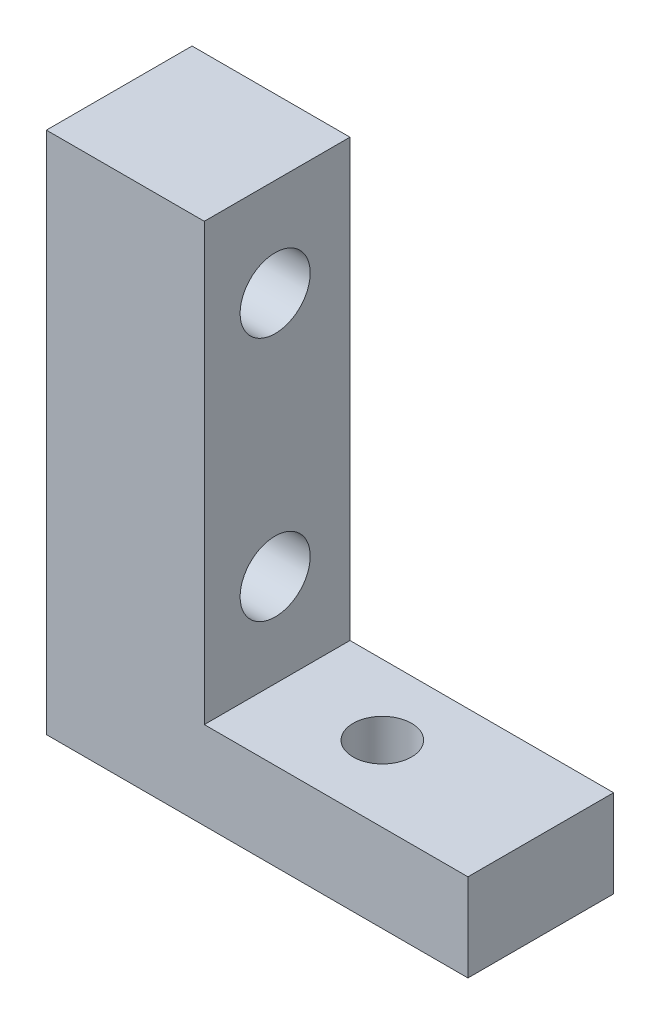
ISO-10303-21;
HEADER;
FILE_DESCRIPTION(('STEP AP214'),'2;1');
FILE_NAME('part.step','',(''),(''),'','','');
FILE_SCHEMA(('AUTOMOTIVE_DESIGN { 1 0 10303 214 1 1 1 1 }'));
ENDSEC;
DATA;
#1=APPLICATION_CONTEXT('core data for automotive mechanical design processes');
#2=APPLICATION_PROTOCOL_DEFINITION('international standard','automotive_design',2000,#1);
#3=PRODUCT_CONTEXT('',#1,'mechanical');
#4=PRODUCT('Part','Part','',(#3));
#5=PRODUCT_RELATED_PRODUCT_CATEGORY('part','',(#4));
#6=PRODUCT_DEFINITION_FORMATION('','',#4);
#7=PRODUCT_DEFINITION_CONTEXT('part definition',#1,'design');
#8=PRODUCT_DEFINITION('design','',#6,#7);
#9=PRODUCT_DEFINITION_SHAPE('','',#8);
#10=(LENGTH_UNIT() NAMED_UNIT(*) SI_UNIT(.MILLI.,.METRE.));
#11=(NAMED_UNIT(*) PLANE_ANGLE_UNIT() SI_UNIT($,.RADIAN.));
#12=(NAMED_UNIT(*) SI_UNIT($,.STERADIAN.) SOLID_ANGLE_UNIT());
#13=UNCERTAINTY_MEASURE_WITH_UNIT(LENGTH_MEASURE(1.E-05),#10,'distance_accuracy_value','');
#14=(GEOMETRIC_REPRESENTATION_CONTEXT(3) GLOBAL_UNCERTAINTY_ASSIGNED_CONTEXT((#13)) GLOBAL_UNIT_ASSIGNED_CONTEXT((#10,
#11,#12)) REPRESENTATION_CONTEXT('',''));
#15=CARTESIAN_POINT('',(0.,0.,0.));
#16=DIRECTION('',(0.,0.,1.));
#17=DIRECTION('',(1.,0.,0.));
#18=AXIS2_PLACEMENT_3D('',#15,#16,#17);
#19=CARTESIAN_POINT('',(0.,3.81,-6.33268934560505));
#20=DIRECTION('',(0.,-1.,0.));
#21=DIRECTION('',(0.,0.,-1.));
#22=AXIS2_PLACEMENT_3D('',#19,#20,#21);
#23=PLANE('',#22);
#24=DIRECTION('',(-1.,0.,0.));
#25=VECTOR('',#24,1.);
#26=CARTESIAN_POINT('',(0.,3.81,-6.33268934560505));
#27=LINE('',#26,#25);
#28=CARTESIAN_POINT('',(18.3256643514369,3.81,-6.33268934560505));
#29=VERTEX_POINT('',#28);
#30=CARTESIAN_POINT('',(6.86474232692635,3.81,-6.33268934560505));
#31=VERTEX_POINT('',#30);
#32=EDGE_CURVE('E101',#29,#31,#27,.T.);
#33=ORIENTED_EDGE('',*,*,#32,.T.);
#34=DIRECTION('',(0.,0.,1.));
#35=VECTOR('',#34,1.);
#36=CARTESIAN_POINT('',(6.86474232692635,3.81,0.));
#37=LINE('',#36,#35);
#38=CARTESIAN_POINT('',(6.86474232692635,3.81,0.));
#39=VERTEX_POINT('',#38);
#40=EDGE_CURVE('E126',#31,#39,#37,.T.);
#41=ORIENTED_EDGE('',*,*,#40,.T.);
#42=DIRECTION('',(1.,0.,0.));
#43=VECTOR('',#42,1.);
#44=CARTESIAN_POINT('',(0.,3.81,0.));
#45=LINE('',#44,#43);
#46=CARTESIAN_POINT('',(18.3256643514369,3.81,0.));
#47=VERTEX_POINT('',#46);
#48=EDGE_CURVE('E90',#39,#47,#45,.T.);
#49=ORIENTED_EDGE('',*,*,#48,.T.);
#50=DIRECTION('',(0.,0.,-1.));
#51=VECTOR('',#50,1.);
#52=CARTESIAN_POINT('',(18.3256643514369,3.81,0.));
#53=LINE('',#52,#51);
#54=EDGE_CURVE('E58',#47,#29,#53,.T.);
#55=ORIENTED_EDGE('',*,*,#54,.T.);
#56=EDGE_LOOP('',(#33,#41,#49,#55));
#57=FACE_BOUND('',#56,.T.);
#58=CARTESIAN_POINT('',(11.3204245658913,3.81,-3.28441168549887));
#59=DIRECTION('',(0.,1.,0.));
#60=DIRECTION('',(0.,0.,1.));
#61=AXIS2_PLACEMENT_3D('',#58,#59,#60);
#62=CIRCLE('',#61,1.27);
#63=CARTESIAN_POINT('',(11.3204245658913,3.81,-4.55441168549887));
#64=VERTEX_POINT('',#63);
#65=EDGE_CURVE('E106',#64,#64,#62,.T.);
#66=ORIENTED_EDGE('',*,*,#65,.F.);
#67=EDGE_LOOP('',(#66));
#68=FACE_BOUND('',#67,.T.);
#69=ADVANCED_FACE('F32',(#57,#68),#23,.F.);
#70=CARTESIAN_POINT('',(0.,0.,-6.33268934560505));
#71=DIRECTION('',(0.,-1.,0.));
#72=DIRECTION('',(0.,0.,-1.));
#73=AXIS2_PLACEMENT_3D('',#70,#71,#72);
#74=PLANE('',#73);
#75=DIRECTION('',(0.,0.,1.));
#76=VECTOR('',#75,1.);
#77=CARTESIAN_POINT('',(0.,0.,0.));
#78=LINE('',#77,#76);
#79=CARTESIAN_POINT('',(0.,0.,-6.33268934560505));
#80=VERTEX_POINT('',#79);
#81=CARTESIAN_POINT('',(0.,0.,0.));
#82=VERTEX_POINT('',#81);
#83=EDGE_CURVE('E98',#80,#82,#78,.T.);
#84=ORIENTED_EDGE('',*,*,#83,.F.);
#85=DIRECTION('',(-1.,0.,0.));
#86=VECTOR('',#85,1.);
#87=CARTESIAN_POINT('',(0.,0.,-6.33268934560505));
#88=LINE('',#87,#86);
#89=CARTESIAN_POINT('',(18.3256643514369,0.,-6.33268934560505));
#90=VERTEX_POINT('',#89);
#91=EDGE_CURVE('E78',#90,#80,#88,.T.);
#92=ORIENTED_EDGE('',*,*,#91,.F.);
#93=DIRECTION('',(0.,0.,-1.));
#94=VECTOR('',#93,1.);
#95=CARTESIAN_POINT('',(18.3256643514369,0.,0.));
#96=LINE('',#95,#94);
#97=CARTESIAN_POINT('',(18.3256643514369,0.,0.));
#98=VERTEX_POINT('',#97);
#99=EDGE_CURVE('E91',#98,#90,#96,.T.);
#100=ORIENTED_EDGE('',*,*,#99,.F.);
#101=DIRECTION('',(1.,0.,0.));
#102=VECTOR('',#101,1.);
#103=CARTESIAN_POINT('',(0.,0.,0.));
#104=LINE('',#103,#102);
#105=EDGE_CURVE('E105',#82,#98,#104,.T.);
#106=ORIENTED_EDGE('',*,*,#105,.F.);
#107=EDGE_LOOP('',(#84,#92,#100,#106));
#108=FACE_BOUND('',#107,.T.);
#109=CARTESIAN_POINT('',(11.3204245658913,0.,-3.28441168549887));
#110=DIRECTION('',(0.,1.,0.));
#111=DIRECTION('',(0.,0.,1.));
#112=AXIS2_PLACEMENT_3D('',#109,#110,#111);
#113=CIRCLE('',#112,1.27);
#114=CARTESIAN_POINT('',(11.3204245658913,0.,-4.55441168549887));
#115=VERTEX_POINT('',#114);
#116=EDGE_CURVE('E110',#115,#115,#113,.T.);
#117=ORIENTED_EDGE('',*,*,#116,.T.);
#118=EDGE_LOOP('',(#117));
#119=FACE_BOUND('',#118,.T.);
#120=ADVANCED_FACE('F103',(#108,#119),#74,.T.);
#121=CARTESIAN_POINT('',(0.,3.81,0.));
#122=DIRECTION('',(1.,0.,0.));
#123=DIRECTION('',(0.,0.,-1.));
#124=AXIS2_PLACEMENT_3D('',#121,#122,#123);
#125=PLANE('',#124);
#126=ORIENTED_EDGE('',*,*,#83,.T.);
#127=DIRECTION('',(0.,-1.,0.));
#128=VECTOR('',#127,1.);
#129=CARTESIAN_POINT('',(0.,3.81,0.));
#130=LINE('',#129,#128);
#131=CARTESIAN_POINT('',(0.,22.7593746557844,0.));
#132=VERTEX_POINT('',#131);
#133=EDGE_CURVE('E11',#132,#82,#130,.T.);
#134=ORIENTED_EDGE('',*,*,#133,.F.);
#135=DIRECTION('',(0.,0.,-1.));
#136=VECTOR('',#135,1.);
#137=CARTESIAN_POINT('',(0.,22.7593746557844,0.));
#138=LINE('',#137,#136);
#139=CARTESIAN_POINT('',(0.,22.7593746557844,-6.33268934560505));
#140=VERTEX_POINT('',#139);
#141=EDGE_CURVE('E100',#132,#140,#138,.T.);
#142=ORIENTED_EDGE('',*,*,#141,.T.);
#143=DIRECTION('',(0.,-1.,0.));
#144=VECTOR('',#143,1.);
#145=CARTESIAN_POINT('',(0.,3.81,-6.33268934560505));
#146=LINE('',#145,#144);
#147=EDGE_CURVE('E83',#140,#80,#146,.T.);
#148=ORIENTED_EDGE('',*,*,#147,.T.);
#149=EDGE_LOOP('',(#126,#134,#142,#148));
#150=FACE_BOUND('',#149,.T.);
#151=CARTESIAN_POINT('',(0.,7.84637761386876,-3.08024665249462));
#152=DIRECTION('',(-1.,0.,0.));
#153=DIRECTION('',(0.,0.,1.));
#154=AXIS2_PLACEMENT_3D('',#151,#152,#153);
#155=CIRCLE('',#154,1.524);
#156=CARTESIAN_POINT('',(0.,7.84637761386876,-1.55624665249462));
#157=VERTEX_POINT('',#156);
#158=EDGE_CURVE('E272',#157,#157,#155,.T.);
#159=ORIENTED_EDGE('',*,*,#158,.F.);
#160=EDGE_LOOP('',(#159));
#161=FACE_BOUND('',#160,.T.);
#162=CARTESIAN_POINT('',(0.,18.5143776138688,-3.08024665249462));
#163=DIRECTION('',(-1.,0.,0.));
#164=DIRECTION('',(0.,0.,1.));
#165=AXIS2_PLACEMENT_3D('',#162,#163,#164);
#166=CIRCLE('',#165,1.524);
#167=CARTESIAN_POINT('',(0.,18.5143776138688,-1.55624665249462));
#168=VERTEX_POINT('',#167);
#169=EDGE_CURVE('E274',#168,#168,#166,.T.);
#170=ORIENTED_EDGE('',*,*,#169,.F.);
#171=EDGE_LOOP('',(#170));
#172=FACE_BOUND('',#171,.T.);
#173=ADVANCED_FACE('F34',(#150,#161,#172),#125,.F.);
#174=CARTESIAN_POINT('',(0.,3.81,0.));
#175=DIRECTION('',(0.,0.,-1.));
#176=DIRECTION('',(-1.,0.,0.));
#177=AXIS2_PLACEMENT_3D('',#174,#175,#176);
#178=PLANE('',#177);
#179=ORIENTED_EDGE('',*,*,#105,.T.);
#180=DIRECTION('',(0.,-1.,0.));
#181=VECTOR('',#180,1.);
#182=CARTESIAN_POINT('',(18.3256643514369,3.81,0.));
#183=LINE('',#182,#181);
#184=EDGE_CURVE('E41',#47,#98,#183,.T.);
#185=ORIENTED_EDGE('',*,*,#184,.F.);
#186=ORIENTED_EDGE('',*,*,#48,.F.);
#187=DIRECTION('',(0.,1.,0.));
#188=VECTOR('',#187,1.);
#189=CARTESIAN_POINT('',(6.86474232692635,3.81,0.));
#190=LINE('',#189,#188);
#191=CARTESIAN_POINT('',(6.86474232692635,22.7593746557844,0.));
#192=VERTEX_POINT('',#191);
#193=EDGE_CURVE('E49',#39,#192,#190,.T.);
#194=ORIENTED_EDGE('',*,*,#193,.T.);
#195=DIRECTION('',(-1.,0.,0.));
#196=VECTOR('',#195,1.);
#197=CARTESIAN_POINT('',(6.86474232692635,22.7593746557844,0.));
#198=LINE('',#197,#196);
#199=EDGE_CURVE('E137',#192,#132,#198,.T.);
#200=ORIENTED_EDGE('',*,*,#199,.T.);
#201=ORIENTED_EDGE('',*,*,#133,.T.);
#202=EDGE_LOOP('',(#179,#185,#186,#194,#200,#201));
#203=FACE_BOUND('',#202,.T.);
#204=ADVANCED_FACE('F173',(#203),#178,.F.);
#205=CARTESIAN_POINT('',(18.3256643514369,3.81,0.));
#206=DIRECTION('',(-1.,0.,0.));
#207=DIRECTION('',(0.,0.,1.));
#208=AXIS2_PLACEMENT_3D('',#205,#206,#207);
#209=PLANE('',#208);
#210=ORIENTED_EDGE('',*,*,#99,.T.);
#211=DIRECTION('',(0.,-1.,0.));
#212=VECTOR('',#211,1.);
#213=CARTESIAN_POINT('',(18.3256643514369,3.81,-6.33268934560505));
#214=LINE('',#213,#212);
#215=EDGE_CURVE('E86',#29,#90,#214,.T.);
#216=ORIENTED_EDGE('',*,*,#215,.F.);
#217=ORIENTED_EDGE('',*,*,#54,.F.);
#218=ORIENTED_EDGE('',*,*,#184,.T.);
#219=EDGE_LOOP('',(#210,#216,#217,#218));
#220=FACE_BOUND('',#219,.T.);
#221=ADVANCED_FACE('F163',(#220),#209,.F.);
#222=CARTESIAN_POINT('',(0.,3.81,-6.33268934560505));
#223=DIRECTION('',(0.,0.,1.));
#224=DIRECTION('',(1.,0.,0.));
#225=AXIS2_PLACEMENT_3D('',#222,#223,#224);
#226=PLANE('',#225);
#227=ORIENTED_EDGE('',*,*,#91,.T.);
#228=ORIENTED_EDGE('',*,*,#147,.F.);
#229=DIRECTION('',(-1.,0.,0.));
#230=VECTOR('',#229,1.);
#231=CARTESIAN_POINT('',(6.86474232692635,22.7593746557844,-6.33268934560505));
#232=LINE('',#231,#230);
#233=CARTESIAN_POINT('',(6.86474232692635,22.7593746557844,-6.33268934560505));
#234=VERTEX_POINT('',#233);
#235=EDGE_CURVE('E133',#234,#140,#232,.T.);
#236=ORIENTED_EDGE('',*,*,#235,.F.);
#237=DIRECTION('',(0.,-1.,0.));
#238=VECTOR('',#237,1.);
#239=CARTESIAN_POINT('',(6.86474232692635,3.81,-6.33268934560505));
#240=LINE('',#239,#238);
#241=EDGE_CURVE('E132',#234,#31,#240,.T.);
#242=ORIENTED_EDGE('',*,*,#241,.T.);
#243=ORIENTED_EDGE('',*,*,#32,.F.);
#244=ORIENTED_EDGE('',*,*,#215,.T.);
#245=EDGE_LOOP('',(#227,#228,#236,#242,#243,#244));
#246=FACE_BOUND('',#245,.T.);
#247=ADVANCED_FACE('F80',(#246),#226,.F.);
#248=CARTESIAN_POINT('',(11.3204245658913,3.81,-3.28441168549887));
#249=DIRECTION('',(0.,-1.,0.));
#250=DIRECTION('',(0.,0.,-1.));
#251=AXIS2_PLACEMENT_3D('',#248,#249,#250);
#252=CYLINDRICAL_SURFACE('',#251,1.27);
#253=CARTESIAN_POINT('',(11.3204245658913,3.81,-4.55441168549887));
#254=CARTESIAN_POINT('',(11.3204245658913,3.7703125,-4.55441168549887));
#255=CARTESIAN_POINT('',(11.3204245658913,3.730625,-4.55441168549887));
#256=CARTESIAN_POINT('',(11.3204245658913,3.65125,-4.55441168549887));
#257=CARTESIAN_POINT('',(11.3204245658913,3.6115625,-4.55441168549887));
#258=CARTESIAN_POINT('',(11.3204245658913,3.5321875,-4.55441168549887));
#259=CARTESIAN_POINT('',(11.3204245658913,3.4925,-4.55441168549887));
#260=CARTESIAN_POINT('',(11.3204245658913,3.413125,-4.55441168549887));
#261=CARTESIAN_POINT('',(11.3204245658913,3.3734375,-4.55441168549887));
#262=CARTESIAN_POINT('',(11.3204245658913,3.2940625,-4.55441168549887));
#263=CARTESIAN_POINT('',(11.3204245658913,3.254375,-4.55441168549887));
#264=CARTESIAN_POINT('',(11.3204245658913,3.175,-4.55441168549887));
#265=CARTESIAN_POINT('',(11.3204245658913,3.1353125,-4.55441168549887));
#266=CARTESIAN_POINT('',(11.3204245658913,3.0559375,-4.55441168549887));
#267=CARTESIAN_POINT('',(11.3204245658913,3.01625,-4.55441168549887));
#268=CARTESIAN_POINT('',(11.3204245658913,2.936875,-4.55441168549887));
#269=CARTESIAN_POINT('',(11.3204245658913,2.8971875,-4.55441168549887));
#270=CARTESIAN_POINT('',(11.3204245658913,2.8178125,-4.55441168549887));
#271=CARTESIAN_POINT('',(11.3204245658913,2.778125,-4.55441168549887));
#272=CARTESIAN_POINT('',(11.3204245658913,2.69875,-4.55441168549887));
#273=CARTESIAN_POINT('',(11.3204245658913,2.6590625,-4.55441168549887));
#274=CARTESIAN_POINT('',(11.3204245658913,2.5796875,-4.55441168549887));
#275=CARTESIAN_POINT('',(11.3204245658913,2.54,-4.55441168549887));
#276=CARTESIAN_POINT('',(11.3204245658913,2.460625,-4.55441168549887));
#277=CARTESIAN_POINT('',(11.3204245658913,2.4209375,-4.55441168549887));
#278=CARTESIAN_POINT('',(11.3204245658913,2.3415625,-4.55441168549887));
#279=CARTESIAN_POINT('',(11.3204245658913,2.301875,-4.55441168549887));
#280=CARTESIAN_POINT('',(11.3204245658913,2.2225,-4.55441168549887));
#281=CARTESIAN_POINT('',(11.3204245658913,2.1828125,-4.55441168549887));
#282=CARTESIAN_POINT('',(11.3204245658913,2.1034375,-4.55441168549887));
#283=CARTESIAN_POINT('',(11.3204245658913,2.06375,-4.55441168549887));
#284=CARTESIAN_POINT('',(11.3204245658913,1.984375,-4.55441168549887));
#285=CARTESIAN_POINT('',(11.3204245658913,1.9446875,-4.55441168549887));
#286=CARTESIAN_POINT('',(11.3204245658913,1.8653125,-4.55441168549887));
#287=CARTESIAN_POINT('',(11.3204245658913,1.825625,-4.55441168549887));
#288=CARTESIAN_POINT('',(11.3204245658913,1.74625,-4.55441168549887));
#289=CARTESIAN_POINT('',(11.3204245658913,1.7065625,-4.55441168549887));
#290=CARTESIAN_POINT('',(11.3204245658913,1.6271875,-4.55441168549887));
#291=CARTESIAN_POINT('',(11.3204245658913,1.5875,-4.55441168549887));
#292=CARTESIAN_POINT('',(11.3204245658913,1.508125,-4.55441168549887));
#293=CARTESIAN_POINT('',(11.3204245658913,1.4684375,-4.55441168549887));
#294=CARTESIAN_POINT('',(11.3204245658913,1.3890625,-4.55441168549887));
#295=CARTESIAN_POINT('',(11.3204245658913,1.349375,-4.55441168549887));
#296=CARTESIAN_POINT('',(11.3204245658913,1.27,-4.55441168549887));
#297=CARTESIAN_POINT('',(11.3204245658913,1.2303125,-4.55441168549887));
#298=CARTESIAN_POINT('',(11.3204245658913,1.1509375,-4.55441168549887));
#299=CARTESIAN_POINT('',(11.3204245658913,1.11125,-4.55441168549887));
#300=CARTESIAN_POINT('',(11.3204245658913,1.031875,-4.55441168549887));
#301=CARTESIAN_POINT('',(11.3204245658913,0.9921875,-4.55441168549887));
#302=CARTESIAN_POINT('',(11.3204245658913,0.9128125,-4.55441168549887));
#303=CARTESIAN_POINT('',(11.3204245658913,0.873125,-4.55441168549887));
#304=CARTESIAN_POINT('',(11.3204245658913,0.79375,-4.55441168549887));
#305=CARTESIAN_POINT('',(11.3204245658913,0.7540625,-4.55441168549887));
#306=CARTESIAN_POINT('',(11.3204245658913,0.6746875,-4.55441168549887));
#307=CARTESIAN_POINT('',(11.3204245658913,0.635,-4.55441168549887));
#308=CARTESIAN_POINT('',(11.3204245658913,0.555625,-4.55441168549887));
#309=CARTESIAN_POINT('',(11.3204245658913,0.5159375,-4.55441168549887));
#310=CARTESIAN_POINT('',(11.3204245658913,0.4365625,-4.55441168549887));
#311=CARTESIAN_POINT('',(11.3204245658913,0.396875,-4.55441168549887));
#312=CARTESIAN_POINT('',(11.3204245658913,0.3175,-4.55441168549887));
#313=CARTESIAN_POINT('',(11.3204245658913,0.2778125,-4.55441168549887));
#314=CARTESIAN_POINT('',(11.3204245658913,0.1984375,-4.55441168549887));
#315=CARTESIAN_POINT('',(11.3204245658913,0.15875,-4.55441168549887));
#316=CARTESIAN_POINT('',(11.3204245658913,0.0793749999999999,-4.55441168549887));
#317=CARTESIAN_POINT('',(11.3204245658913,0.0396874999999999,-4.55441168549887));
#318=CARTESIAN_POINT('',(11.3204245658913,0.,-4.55441168549887));
#319=B_SPLINE_CURVE_WITH_KNOTS('',3,(#253,#254,#255,#256,#257,#258,#259,#260,#261,#262,#263,
#264,#265,#266,#267,#268,#269,#270,#271,#272,#273,#274,#275,#276,#277,#278,#279,#280,#281,#282,
#283,#284,#285,#286,#287,#288,#289,#290,#291,#292,#293,#294,#295,#296,#297,#298,#299,#300,#301,
#302,#303,#304,#305,#306,#307,#308,#309,#310,#311,#312,#313,#314,#315,#316,#317,#318),
.UNSPECIFIED.,.F.,.F.,(4,2,2,2,2,2,2,2,2,2,2,2,2,2,2,2,2,2,2,2,2,2,2,2,2,2,2,2,2,2,2,2,4),(0.,
0.1190625,0.238125,0.3571875,0.47625,0.5953125,0.714375,0.8334375,0.9525,1.0715625,1.190625,
1.3096875,1.42875,1.5478125,1.666875,1.7859375,1.905,2.0240625,2.143125,2.2621875,2.38125,
2.5003125,2.619375,2.7384375,2.8575,2.9765625,3.095625,3.2146875,3.33375,3.4528125,3.571875,
3.6909375,3.81),.UNSPECIFIED.);
#320=EDGE_CURVE('BSEAM153',#64,#115,#319,.T.);
#321=ORIENTED_EDGE('',*,*,#65,.T.);
#322=ORIENTED_EDGE('',*,*,#116,.F.);
#323=ORIENTED_EDGE('',*,*,#320,.T.);
#324=ORIENTED_EDGE('',*,*,#320,.F.);
#325=EDGE_LOOP('',(#321,#323,#322,#324));
#326=FACE_BOUND('',#325,.T.);
#327=ADVANCED_FACE('F153',(#326),#252,.F.);
#328=CARTESIAN_POINT('',(6.86474232692635,22.7593746557844,0.));
#329=DIRECTION('',(0.,1.,0.));
#330=DIRECTION('',(0.,0.,1.));
#331=AXIS2_PLACEMENT_3D('',#328,#329,#330);
#332=PLANE('',#331);
#333=ORIENTED_EDGE('',*,*,#141,.F.);
#334=ORIENTED_EDGE('',*,*,#199,.F.);
#335=DIRECTION('',(0.,0.,-1.));
#336=VECTOR('',#335,1.);
#337=CARTESIAN_POINT('',(6.86474232692635,22.7593746557844,0.));
#338=LINE('',#337,#336);
#339=EDGE_CURVE('E135',#192,#234,#338,.T.);
#340=ORIENTED_EDGE('',*,*,#339,.T.);
#341=ORIENTED_EDGE('',*,*,#235,.T.);
#342=EDGE_LOOP('',(#333,#334,#340,#341));
#343=FACE_BOUND('',#342,.T.);
#344=ADVANCED_FACE('F155',(#343),#332,.T.);
#345=CARTESIAN_POINT('',(6.86474232692635,22.7593746557844,0.));
#346=DIRECTION('',(-1.,0.,0.));
#347=DIRECTION('',(0.,0.,1.));
#348=AXIS2_PLACEMENT_3D('',#345,#346,#347);
#349=PLANE('',#348);
#350=CARTESIAN_POINT('',(6.86474232692635,7.84637761386876,-3.08024665249462));
#351=DIRECTION('',(-1.,0.,0.));
#352=DIRECTION('',(0.,0.,1.));
#353=AXIS2_PLACEMENT_3D('',#350,#351,#352);
#354=CIRCLE('',#353,1.524);
#355=CARTESIAN_POINT('',(6.86474232692635,7.84637761386876,-1.55624665249462));
#356=VERTEX_POINT('',#355);
#357=EDGE_CURVE('E269',#356,#356,#354,.T.);
#358=ORIENTED_EDGE('',*,*,#357,.T.);
#359=EDGE_LOOP('',(#358));
#360=FACE_BOUND('',#359,.T.);
#361=CARTESIAN_POINT('',(6.86474232692635,18.5143776138688,-3.08024665249462));
#362=DIRECTION('',(-1.,0.,0.));
#363=DIRECTION('',(0.,0.,1.));
#364=AXIS2_PLACEMENT_3D('',#361,#362,#363);
#365=CIRCLE('',#364,1.524);
#366=CARTESIAN_POINT('',(6.86474232692635,18.5143776138688,-1.55624665249462));
#367=VERTEX_POINT('',#366);
#368=EDGE_CURVE('E148',#367,#367,#365,.T.);
#369=ORIENTED_EDGE('',*,*,#368,.T.);
#370=EDGE_LOOP('',(#369));
#371=FACE_BOUND('',#370,.T.);
#372=ORIENTED_EDGE('',*,*,#193,.F.);
#373=ORIENTED_EDGE('',*,*,#40,.F.);
#374=ORIENTED_EDGE('',*,*,#241,.F.);
#375=ORIENTED_EDGE('',*,*,#339,.F.);
#376=EDGE_LOOP('',(#372,#373,#374,#375));
#377=FACE_BOUND('',#376,.T.);
#378=ADVANCED_FACE('F136',(#360,#371,#377),#349,.F.);
#379=CARTESIAN_POINT('',(6.86474232692635,18.5143776138688,-3.08024665249462));
#380=DIRECTION('',(-1.,0.,0.));
#381=DIRECTION('',(0.,0.,1.));
#382=AXIS2_PLACEMENT_3D('',#379,#380,#381);
#383=CYLINDRICAL_SURFACE('',#382,1.524);
#384=ORIENTED_EDGE('',*,*,#368,.F.);
#385=EDGE_LOOP('',(#384));
#386=FACE_BOUND('',#385,.T.);
#387=ORIENTED_EDGE('',*,*,#169,.T.);
#388=EDGE_LOOP('',(#387));
#389=FACE_BOUND('',#388,.T.);
#390=ADVANCED_FACE('F242',(#386,#389),#383,.F.);
#391=CARTESIAN_POINT('',(6.86474232692635,7.84637761386876,-3.08024665249462));
#392=DIRECTION('',(-1.,0.,0.));
#393=DIRECTION('',(0.,0.,1.));
#394=AXIS2_PLACEMENT_3D('',#391,#392,#393);
#395=CYLINDRICAL_SURFACE('',#394,1.524);
#396=ORIENTED_EDGE('',*,*,#357,.F.);
#397=EDGE_LOOP('',(#396));
#398=FACE_BOUND('',#397,.T.);
#399=ORIENTED_EDGE('',*,*,#158,.T.);
#400=EDGE_LOOP('',(#399));
#401=FACE_BOUND('',#400,.T.);
#402=ADVANCED_FACE('F251',(#398,#401),#395,.F.);
#403=CLOSED_SHELL('',(#69,#120,#173,#204,#221,#247,#327,#344,#378,#390,#402));
#404=MANIFOLD_SOLID_BREP('B2',#403);
#405=ADVANCED_BREP_SHAPE_REPRESENTATION('',(#18,#404),#14);
#406=SHAPE_DEFINITION_REPRESENTATION(#9,#405);
ENDSEC;
END-ISO-10303-21;
